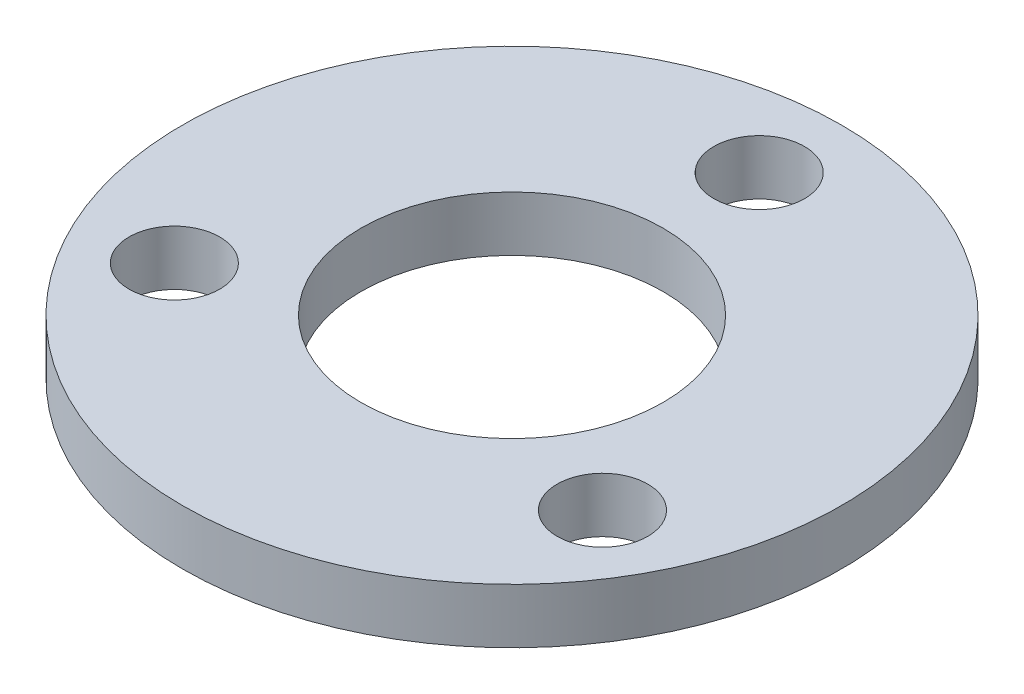
ISO-10303-21;
HEADER;
FILE_DESCRIPTION(('STEP AP214'),'2;1');
FILE_NAME('part.step','',(''),(''),'','','');
FILE_SCHEMA(('AUTOMOTIVE_DESIGN { 1 0 10303 214 1 1 1 1 }'));
ENDSEC;
DATA;
#1=APPLICATION_CONTEXT('core data for automotive mechanical design processes');
#2=APPLICATION_PROTOCOL_DEFINITION('international standard','automotive_design',2000,#1);
#3=PRODUCT_CONTEXT('',#1,'mechanical');
#4=PRODUCT('Part','Part','',(#3));
#5=PRODUCT_RELATED_PRODUCT_CATEGORY('part','',(#4));
#6=PRODUCT_DEFINITION_FORMATION('','',#4);
#7=PRODUCT_DEFINITION_CONTEXT('part definition',#1,'design');
#8=PRODUCT_DEFINITION('design','',#6,#7);
#9=PRODUCT_DEFINITION_SHAPE('','',#8);
#10=(LENGTH_UNIT() NAMED_UNIT(*) SI_UNIT(.MILLI.,.METRE.));
#11=(NAMED_UNIT(*) PLANE_ANGLE_UNIT() SI_UNIT($,.RADIAN.));
#12=(NAMED_UNIT(*) SI_UNIT($,.STERADIAN.) SOLID_ANGLE_UNIT());
#13=UNCERTAINTY_MEASURE_WITH_UNIT(LENGTH_MEASURE(1.E-05),#10,'distance_accuracy_value','');
#14=(GEOMETRIC_REPRESENTATION_CONTEXT(3) GLOBAL_UNCERTAINTY_ASSIGNED_CONTEXT((#13)) GLOBAL_UNIT_ASSIGNED_CONTEXT((#10,
#11,#12)) REPRESENTATION_CONTEXT('',''));
#15=CARTESIAN_POINT('',(0.,0.,0.));
#16=DIRECTION('',(0.,0.,1.));
#17=DIRECTION('',(1.,0.,0.));
#18=AXIS2_PLACEMENT_3D('',#15,#16,#17);
#19=CARTESIAN_POINT('',(0.,2.,0.));
#20=DIRECTION('',(0.,1.,0.));
#21=DIRECTION('',(0.,0.,1.));
#22=AXIS2_PLACEMENT_3D('',#19,#20,#21);
#23=PLANE('',#22);
#24=CARTESIAN_POINT('',(0.,2.,0.));
#25=DIRECTION('',(0.,1.,0.));
#26=DIRECTION('',(0.,0.,1.));
#27=AXIS2_PLACEMENT_3D('',#24,#25,#26);
#28=CIRCLE('',#27,5.5);
#29=CARTESIAN_POINT('',(0.,2.,5.5));
#30=VERTEX_POINT('',#29);
#31=EDGE_CURVE('E56',#30,#30,#28,.T.);
#32=ORIENTED_EDGE('',*,*,#31,.F.);
#33=EDGE_LOOP('',(#32));
#34=FACE_BOUND('',#33,.T.);
#35=CARTESIAN_POINT('',(0.,2.,-9.));
#36=DIRECTION('',(0.,1.,0.));
#37=DIRECTION('',(0.,0.,1.));
#38=AXIS2_PLACEMENT_3D('',#35,#36,#37);
#39=CIRCLE('',#38,1.65);
#40=CARTESIAN_POINT('',(0.,2.,-7.35));
#41=VERTEX_POINT('',#40);
#42=EDGE_CURVE('E45',#41,#41,#39,.T.);
#43=ORIENTED_EDGE('',*,*,#42,.F.);
#44=EDGE_LOOP('',(#43));
#45=FACE_BOUND('',#44,.T.);
#46=CARTESIAN_POINT('',(0.,2.,0.));
#47=DIRECTION('',(0.,1.,0.));
#48=DIRECTION('',(0.,0.,1.));
#49=AXIS2_PLACEMENT_3D('',#46,#47,#48);
#50=CIRCLE('',#49,12.);
#51=CARTESIAN_POINT('',(0.,2.,12.));
#52=VERTEX_POINT('',#51);
#53=EDGE_CURVE('E10',#52,#52,#50,.T.);
#54=ORIENTED_EDGE('',*,*,#53,.T.);
#55=EDGE_LOOP('',(#54));
#56=FACE_BOUND('',#55,.T.);
#57=CARTESIAN_POINT('',(-7.79422863405999,2.,4.49999999999993));
#58=DIRECTION('',(0.,1.,0.));
#59=DIRECTION('',(0.,0.,1.));
#60=AXIS2_PLACEMENT_3D('',#57,#58,#59);
#61=CIRCLE('',#60,1.65);
#62=CARTESIAN_POINT('',(-7.79422863405999,2.,6.14999999999993));
#63=VERTEX_POINT('',#62);
#64=EDGE_CURVE('E50',#63,#63,#61,.T.);
#65=ORIENTED_EDGE('',*,*,#64,.F.);
#66=EDGE_LOOP('',(#65));
#67=FACE_BOUND('',#66,.T.);
#68=CARTESIAN_POINT('',(7.79422863405993,2.,4.50000000000004));
#69=DIRECTION('',(0.,1.,0.));
#70=DIRECTION('',(0.,0.,1.));
#71=AXIS2_PLACEMENT_3D('',#68,#69,#70);
#72=CIRCLE('',#71,1.65);
#73=CARTESIAN_POINT('',(7.79422863405993,2.,6.15000000000004));
#74=VERTEX_POINT('',#73);
#75=EDGE_CURVE('E62',#74,#74,#72,.T.);
#76=ORIENTED_EDGE('',*,*,#75,.F.);
#77=EDGE_LOOP('',(#76));
#78=FACE_BOUND('',#77,.T.);
#79=ADVANCED_FACE('F34',(#34,#45,#56,#67,#78),#23,.T.);
#80=CARTESIAN_POINT('',(0.,0.,0.));
#81=DIRECTION('',(0.,1.,0.));
#82=DIRECTION('',(0.,0.,1.));
#83=AXIS2_PLACEMENT_3D('',#80,#81,#82);
#84=PLANE('',#83);
#85=CARTESIAN_POINT('',(0.,0.,0.));
#86=DIRECTION('',(0.,1.,0.));
#87=DIRECTION('',(0.,0.,1.));
#88=AXIS2_PLACEMENT_3D('',#85,#86,#87);
#89=CIRCLE('',#88,12.);
#90=CARTESIAN_POINT('',(0.,0.,12.));
#91=VERTEX_POINT('',#90);
#92=EDGE_CURVE('E38',#91,#91,#89,.T.);
#93=ORIENTED_EDGE('',*,*,#92,.F.);
#94=EDGE_LOOP('',(#93));
#95=FACE_BOUND('',#94,.T.);
#96=CARTESIAN_POINT('',(0.,0.,-9.));
#97=DIRECTION('',(0.,1.,0.));
#98=DIRECTION('',(0.,0.,1.));
#99=AXIS2_PLACEMENT_3D('',#96,#97,#98);
#100=CIRCLE('',#99,1.65);
#101=CARTESIAN_POINT('',(0.,0.,-7.35));
#102=VERTEX_POINT('',#101);
#103=EDGE_CURVE('E47',#102,#102,#100,.T.);
#104=ORIENTED_EDGE('',*,*,#103,.T.);
#105=EDGE_LOOP('',(#104));
#106=FACE_BOUND('',#105,.T.);
#107=CARTESIAN_POINT('',(-7.79422863405999,0.,4.49999999999993));
#108=DIRECTION('',(0.,1.,0.));
#109=DIRECTION('',(0.,0.,1.));
#110=AXIS2_PLACEMENT_3D('',#107,#108,#109);
#111=CIRCLE('',#110,1.65);
#112=CARTESIAN_POINT('',(-7.79422863405999,0.,6.14999999999993));
#113=VERTEX_POINT('',#112);
#114=EDGE_CURVE('E53',#113,#113,#111,.T.);
#115=ORIENTED_EDGE('',*,*,#114,.T.);
#116=EDGE_LOOP('',(#115));
#117=FACE_BOUND('',#116,.T.);
#118=CARTESIAN_POINT('',(0.,0.,0.));
#119=DIRECTION('',(0.,1.,0.));
#120=DIRECTION('',(0.,0.,1.));
#121=AXIS2_PLACEMENT_3D('',#118,#119,#120);
#122=CIRCLE('',#121,5.5);
#123=CARTESIAN_POINT('',(0.,0.,5.5));
#124=VERTEX_POINT('',#123);
#125=EDGE_CURVE('E59',#124,#124,#122,.T.);
#126=ORIENTED_EDGE('',*,*,#125,.T.);
#127=EDGE_LOOP('',(#126));
#128=FACE_BOUND('',#127,.T.);
#129=CARTESIAN_POINT('',(7.79422863405993,0.,4.50000000000004));
#130=DIRECTION('',(0.,1.,0.));
#131=DIRECTION('',(0.,0.,1.));
#132=AXIS2_PLACEMENT_3D('',#129,#130,#131);
#133=CIRCLE('',#132,1.65);
#134=CARTESIAN_POINT('',(7.79422863405993,0.,6.15000000000004));
#135=VERTEX_POINT('',#134);
#136=EDGE_CURVE('E65',#135,#135,#133,.T.);
#137=ORIENTED_EDGE('',*,*,#136,.T.);
#138=EDGE_LOOP('',(#137));
#139=FACE_BOUND('',#138,.T.);
#140=ADVANCED_FACE('F75',(#95,#106,#117,#128,#139),#84,.F.);
#141=CARTESIAN_POINT('',(0.,2.,0.));
#142=DIRECTION('',(0.,-1.,0.));
#143=DIRECTION('',(0.,0.,-1.));
#144=AXIS2_PLACEMENT_3D('',#141,#142,#143);
#145=CYLINDRICAL_SURFACE('',#144,12.);
#146=ORIENTED_EDGE('',*,*,#53,.F.);
#147=EDGE_LOOP('',(#146));
#148=FACE_BOUND('',#147,.T.);
#149=ORIENTED_EDGE('',*,*,#92,.T.);
#150=EDGE_LOOP('',(#149));
#151=FACE_BOUND('',#150,.T.);
#152=ADVANCED_FACE('F36',(#148,#151),#145,.T.);
#153=CARTESIAN_POINT('',(0.,2.,-9.));
#154=DIRECTION('',(0.,-1.,0.));
#155=DIRECTION('',(0.,0.,-1.));
#156=AXIS2_PLACEMENT_3D('',#153,#154,#155);
#157=CYLINDRICAL_SURFACE('',#156,1.65);
#158=ORIENTED_EDGE('',*,*,#42,.T.);
#159=EDGE_LOOP('',(#158));
#160=FACE_BOUND('',#159,.T.);
#161=ORIENTED_EDGE('',*,*,#103,.F.);
#162=EDGE_LOOP('',(#161));
#163=FACE_BOUND('',#162,.T.);
#164=ADVANCED_FACE('F85',(#160,#163),#157,.F.);
#165=CARTESIAN_POINT('',(-7.79422863405999,2.,4.49999999999993));
#166=DIRECTION('',(0.,-1.,0.));
#167=DIRECTION('',(0.,0.,-1.));
#168=AXIS2_PLACEMENT_3D('',#165,#166,#167);
#169=CYLINDRICAL_SURFACE('',#168,1.65);
#170=ORIENTED_EDGE('',*,*,#64,.T.);
#171=EDGE_LOOP('',(#170));
#172=FACE_BOUND('',#171,.T.);
#173=ORIENTED_EDGE('',*,*,#114,.F.);
#174=EDGE_LOOP('',(#173));
#175=FACE_BOUND('',#174,.T.);
#176=ADVANCED_FACE('F88',(#172,#175),#169,.F.);
#177=CARTESIAN_POINT('',(0.,2.,0.));
#178=DIRECTION('',(0.,-1.,0.));
#179=DIRECTION('',(0.,0.,-1.));
#180=AXIS2_PLACEMENT_3D('',#177,#178,#179);
#181=CYLINDRICAL_SURFACE('',#180,5.5);
#182=ORIENTED_EDGE('',*,*,#31,.T.);
#183=EDGE_LOOP('',(#182));
#184=FACE_BOUND('',#183,.T.);
#185=ORIENTED_EDGE('',*,*,#125,.F.);
#186=EDGE_LOOP('',(#185));
#187=FACE_BOUND('',#186,.T.);
#188=ADVANCED_FACE('F92',(#184,#187),#181,.F.);
#189=CARTESIAN_POINT('',(7.79422863405993,2.,4.50000000000004));
#190=DIRECTION('',(0.,-1.,0.));
#191=DIRECTION('',(0.,0.,-1.));
#192=AXIS2_PLACEMENT_3D('',#189,#190,#191);
#193=CYLINDRICAL_SURFACE('',#192,1.65);
#194=ORIENTED_EDGE('',*,*,#75,.T.);
#195=EDGE_LOOP('',(#194));
#196=FACE_BOUND('',#195,.T.);
#197=ORIENTED_EDGE('',*,*,#136,.F.);
#198=EDGE_LOOP('',(#197));
#199=FACE_BOUND('',#198,.T.);
#200=ADVANCED_FACE('F71',(#196,#199),#193,.F.);
#201=CLOSED_SHELL('',(#79,#140,#152,#164,#176,#188,#200));
#202=MANIFOLD_SOLID_BREP('B2',#201);
#203=ADVANCED_BREP_SHAPE_REPRESENTATION('',(#18,#202),#14);
#204=SHAPE_DEFINITION_REPRESENTATION(#9,#203);
ENDSEC;
END-ISO-10303-21;
